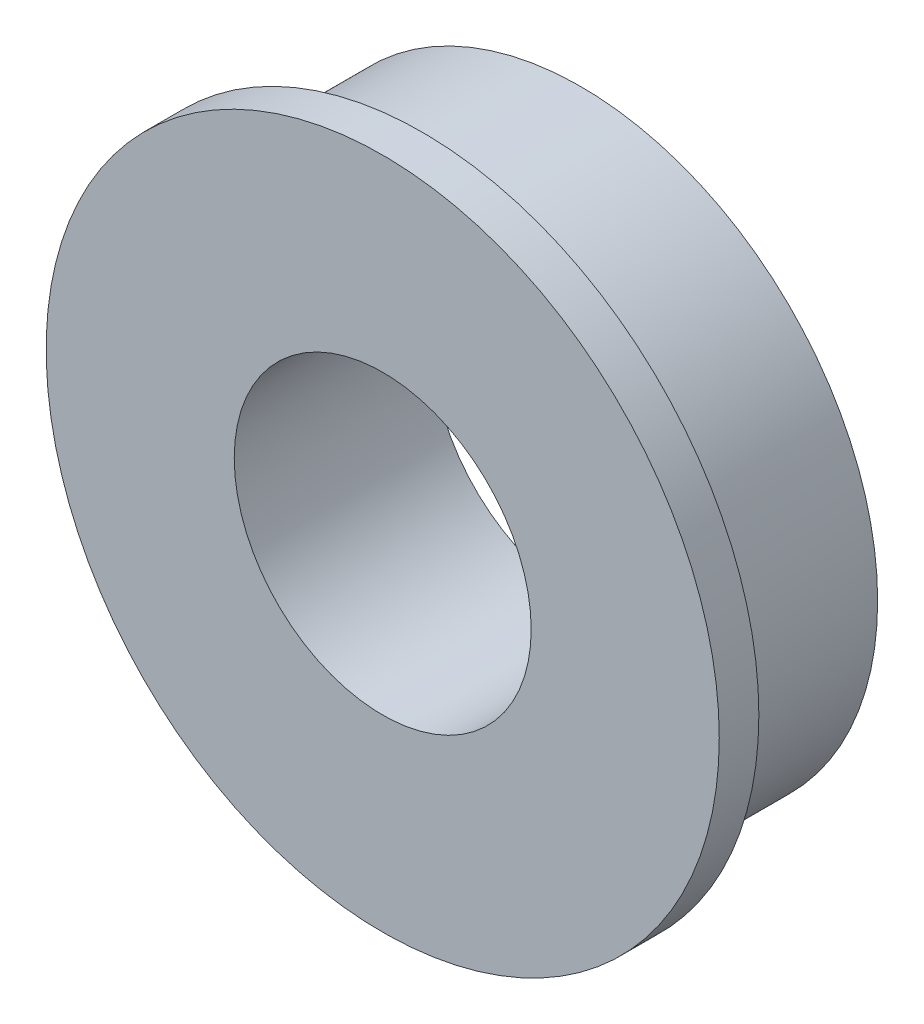
ISO-10303-21;
HEADER;
FILE_DESCRIPTION(('STEP AP214'),'2;1');
FILE_NAME('part.step','',(''),(''),'','','');
FILE_SCHEMA(('AUTOMOTIVE_DESIGN { 1 0 10303 214 1 1 1 1 }'));
ENDSEC;
DATA;
#1=APPLICATION_CONTEXT('core data for automotive mechanical design processes');
#2=APPLICATION_PROTOCOL_DEFINITION('international standard','automotive_design',2000,#1);
#3=PRODUCT_CONTEXT('',#1,'mechanical');
#4=PRODUCT('Part','Part','',(#3));
#5=PRODUCT_RELATED_PRODUCT_CATEGORY('part','',(#4));
#6=PRODUCT_DEFINITION_FORMATION('','',#4);
#7=PRODUCT_DEFINITION_CONTEXT('part definition',#1,'design');
#8=PRODUCT_DEFINITION('design','',#6,#7);
#9=PRODUCT_DEFINITION_SHAPE('','',#8);
#10=(LENGTH_UNIT() NAMED_UNIT(*) SI_UNIT(.MILLI.,.METRE.));
#11=(NAMED_UNIT(*) PLANE_ANGLE_UNIT() SI_UNIT($,.RADIAN.));
#12=(NAMED_UNIT(*) SI_UNIT($,.STERADIAN.) SOLID_ANGLE_UNIT());
#13=UNCERTAINTY_MEASURE_WITH_UNIT(LENGTH_MEASURE(1.E-05),#10,'distance_accuracy_value','');
#14=(GEOMETRIC_REPRESENTATION_CONTEXT(3) GLOBAL_UNCERTAINTY_ASSIGNED_CONTEXT((#13)) GLOBAL_UNIT_ASSIGNED_CONTEXT((#10,
#11,#12)) REPRESENTATION_CONTEXT('',''));
#15=CARTESIAN_POINT('',(0.,0.,0.));
#16=DIRECTION('',(0.,0.,1.));
#17=DIRECTION('',(1.,0.,0.));
#18=AXIS2_PLACEMENT_3D('',#15,#16,#17);
#19=CARTESIAN_POINT('',(0.,0.,4.));
#20=DIRECTION('',(0.,0.,-1.));
#21=DIRECTION('',(-1.,0.,0.));
#22=AXIS2_PLACEMENT_3D('',#19,#20,#21);
#23=CYLINDRICAL_SURFACE('',#22,6.);
#24=CARTESIAN_POINT('',(0.,0.,0.));
#25=DIRECTION('',(0.,0.,1.));
#26=DIRECTION('',(1.,0.,0.));
#27=AXIS2_PLACEMENT_3D('',#24,#25,#26);
#28=CIRCLE('',#27,6.);
#29=CARTESIAN_POINT('',(6.,0.,0.));
#30=VERTEX_POINT('',#29);
#31=EDGE_CURVE('E36',#30,#30,#28,.T.);
#32=ORIENTED_EDGE('',*,*,#31,.T.);
#33=EDGE_LOOP('',(#32));
#34=FACE_BOUND('',#33,.T.);
#35=CARTESIAN_POINT('',(0.,0.,3.2));
#36=DIRECTION('',(0.,0.,1.));
#37=DIRECTION('',(1.,0.,0.));
#38=AXIS2_PLACEMENT_3D('',#35,#36,#37);
#39=CIRCLE('',#38,6.);
#40=CARTESIAN_POINT('',(6.,0.,3.2));
#41=VERTEX_POINT('',#40);
#42=EDGE_CURVE('E10',#41,#41,#39,.T.);
#43=ORIENTED_EDGE('',*,*,#42,.F.);
#44=EDGE_LOOP('',(#43));
#45=FACE_BOUND('',#44,.T.);
#46=ADVANCED_FACE('F34',(#34,#45),#23,.T.);
#47=CARTESIAN_POINT('',(0.,0.,4.));
#48=DIRECTION('',(0.,0.,1.));
#49=DIRECTION('',(1.,0.,0.));
#50=AXIS2_PLACEMENT_3D('',#47,#48,#49);
#51=PLANE('',#50);
#52=CARTESIAN_POINT('',(0.,0.,4.));
#53=DIRECTION('',(0.,0.,1.));
#54=DIRECTION('',(1.,0.,0.));
#55=AXIS2_PLACEMENT_3D('',#52,#53,#54);
#56=CIRCLE('',#55,3.);
#57=CARTESIAN_POINT('',(3.,0.,4.));
#58=VERTEX_POINT('',#57);
#59=EDGE_CURVE('E46',#58,#58,#56,.T.);
#60=ORIENTED_EDGE('',*,*,#59,.F.);
#61=EDGE_LOOP('',(#60));
#62=FACE_BOUND('',#61,.T.);
#63=CARTESIAN_POINT('',(0.,0.,4.));
#64=DIRECTION('',(0.,0.,1.));
#65=DIRECTION('',(1.,0.,0.));
#66=AXIS2_PLACEMENT_3D('',#63,#64,#65);
#67=CIRCLE('',#66,6.8);
#68=CARTESIAN_POINT('',(6.8,0.,4.));
#69=VERTEX_POINT('',#68);
#70=EDGE_CURVE('E47',#69,#69,#67,.T.);
#71=ORIENTED_EDGE('',*,*,#70,.T.);
#72=EDGE_LOOP('',(#71));
#73=FACE_BOUND('',#72,.T.);
#74=ADVANCED_FACE('F65',(#62,#73),#51,.T.);
#75=CARTESIAN_POINT('',(0.,0.,0.));
#76=DIRECTION('',(0.,0.,1.));
#77=DIRECTION('',(1.,0.,0.));
#78=AXIS2_PLACEMENT_3D('',#75,#76,#77);
#79=PLANE('',#78);
#80=ORIENTED_EDGE('',*,*,#31,.F.);
#81=EDGE_LOOP('',(#80));
#82=FACE_BOUND('',#81,.T.);
#83=CARTESIAN_POINT('',(0.,0.,0.));
#84=DIRECTION('',(0.,0.,1.));
#85=DIRECTION('',(1.,0.,0.));
#86=AXIS2_PLACEMENT_3D('',#83,#84,#85);
#87=CIRCLE('',#86,3.);
#88=CARTESIAN_POINT('',(3.,0.,0.));
#89=VERTEX_POINT('',#88);
#90=EDGE_CURVE('E55',#89,#89,#87,.T.);
#91=ORIENTED_EDGE('',*,*,#90,.T.);
#92=EDGE_LOOP('',(#91));
#93=FACE_BOUND('',#92,.T.);
#94=ADVANCED_FACE('F85',(#82,#93),#79,.F.);
#95=CARTESIAN_POINT('',(0.,0.,4.));
#96=DIRECTION('',(0.,0.,-1.));
#97=DIRECTION('',(-1.,0.,0.));
#98=AXIS2_PLACEMENT_3D('',#95,#96,#97);
#99=CYLINDRICAL_SURFACE('',#98,3.);
#100=ORIENTED_EDGE('',*,*,#59,.T.);
#101=EDGE_LOOP('',(#100));
#102=FACE_BOUND('',#101,.T.);
#103=ORIENTED_EDGE('',*,*,#90,.F.);
#104=EDGE_LOOP('',(#103));
#105=FACE_BOUND('',#104,.T.);
#106=ADVANCED_FACE('F75',(#102,#105),#99,.F.);
#107=CARTESIAN_POINT('',(0.,0.,3.2));
#108=DIRECTION('',(0.,0.,1.));
#109=DIRECTION('',(1.,0.,0.));
#110=AXIS2_PLACEMENT_3D('',#107,#108,#109);
#111=PLANE('',#110);
#112=CARTESIAN_POINT('',(0.,0.,3.2));
#113=DIRECTION('',(0.,0.,1.));
#114=DIRECTION('',(1.,0.,0.));
#115=AXIS2_PLACEMENT_3D('',#112,#113,#114);
#116=CIRCLE('',#115,6.8);
#117=CARTESIAN_POINT('',(6.8,0.,3.2));
#118=VERTEX_POINT('',#117);
#119=EDGE_CURVE('E53',#118,#118,#116,.T.);
#120=ORIENTED_EDGE('',*,*,#119,.F.);
#121=EDGE_LOOP('',(#120));
#122=FACE_BOUND('',#121,.T.);
#123=ORIENTED_EDGE('',*,*,#42,.T.);
#124=EDGE_LOOP('',(#123));
#125=FACE_BOUND('',#124,.T.);
#126=ADVANCED_FACE('F70',(#122,#125),#111,.F.);
#127=CARTESIAN_POINT('',(0.,0.,3.2));
#128=DIRECTION('',(0.,0.,1.));
#129=DIRECTION('',(1.,0.,0.));
#130=AXIS2_PLACEMENT_3D('',#127,#128,#129);
#131=CYLINDRICAL_SURFACE('',#130,6.8);
#132=ORIENTED_EDGE('',*,*,#119,.T.);
#133=EDGE_LOOP('',(#132));
#134=FACE_BOUND('',#133,.T.);
#135=ORIENTED_EDGE('',*,*,#70,.F.);
#136=EDGE_LOOP('',(#135));
#137=FACE_BOUND('',#136,.T.);
#138=ADVANCED_FACE('F62',(#134,#137),#131,.T.);
#139=CLOSED_SHELL('',(#46,#74,#94,#106,#126,#138));
#140=MANIFOLD_SOLID_BREP('B2',#139);
#141=ADVANCED_BREP_SHAPE_REPRESENTATION('',(#18,#140),#14);
#142=SHAPE_DEFINITION_REPRESENTATION(#9,#141);
ENDSEC;
END-ISO-10303-21;
